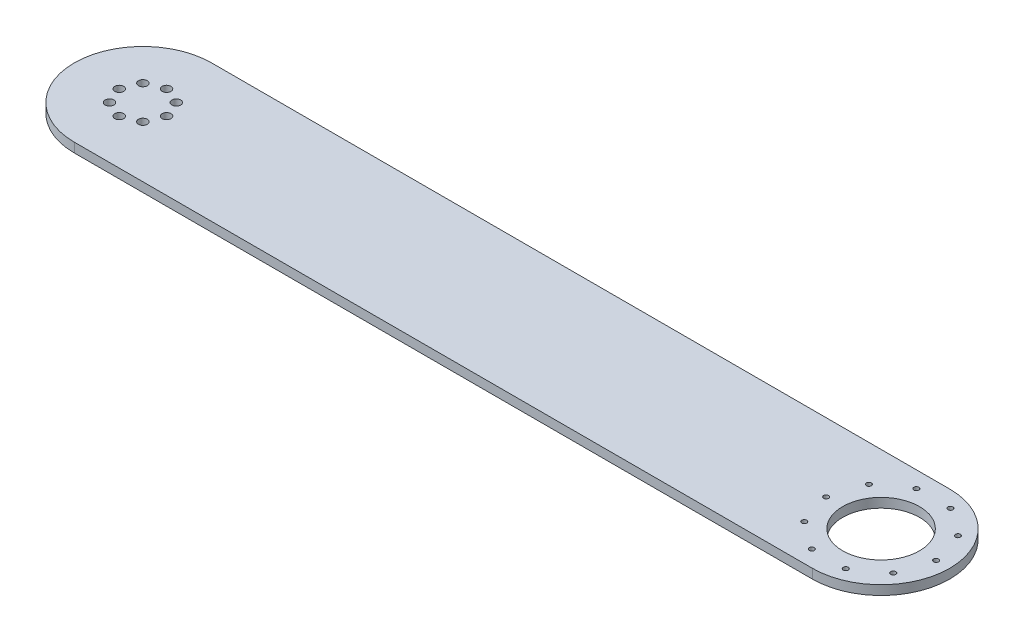
ISO-10303-21;
HEADER;
FILE_DESCRIPTION(('STEP AP214'),'2;1');
FILE_NAME('part.step','',(''),(''),'','','');
FILE_SCHEMA(('AUTOMOTIVE_DESIGN { 1 0 10303 214 1 1 1 1 }'));
ENDSEC;
DATA;
#1=APPLICATION_CONTEXT('core data for automotive mechanical design processes');
#2=APPLICATION_PROTOCOL_DEFINITION('international standard','automotive_design',2000,#1);
#3=PRODUCT_CONTEXT('',#1,'mechanical');
#4=PRODUCT('Part','Part','',(#3));
#5=PRODUCT_RELATED_PRODUCT_CATEGORY('part','',(#4));
#6=PRODUCT_DEFINITION_FORMATION('','',#4);
#7=PRODUCT_DEFINITION_CONTEXT('part definition',#1,'design');
#8=PRODUCT_DEFINITION('design','',#6,#7);
#9=PRODUCT_DEFINITION_SHAPE('','',#8);
#10=(LENGTH_UNIT() NAMED_UNIT(*) SI_UNIT(.MILLI.,.METRE.));
#11=(NAMED_UNIT(*) PLANE_ANGLE_UNIT() SI_UNIT($,.RADIAN.));
#12=(NAMED_UNIT(*) SI_UNIT($,.STERADIAN.) SOLID_ANGLE_UNIT());
#13=UNCERTAINTY_MEASURE_WITH_UNIT(LENGTH_MEASURE(1.E-05),#10,'distance_accuracy_value','');
#14=(GEOMETRIC_REPRESENTATION_CONTEXT(3) GLOBAL_UNCERTAINTY_ASSIGNED_CONTEXT((#13)) GLOBAL_UNIT_ASSIGNED_CONTEXT((#10,
#11,#12)) REPRESENTATION_CONTEXT('',''));
#15=CARTESIAN_POINT('',(0.,0.,0.));
#16=DIRECTION('',(0.,0.,1.));
#17=DIRECTION('',(1.,0.,0.));
#18=AXIS2_PLACEMENT_3D('',#15,#16,#17);
#19=CARTESIAN_POINT('',(0.,6.35,46.5));
#20=DIRECTION('',(0.,0.,-1.));
#21=DIRECTION('',(-1.,0.,0.));
#22=AXIS2_PLACEMENT_3D('',#19,#20,#21);
#23=PLANE('',#22);
#24=DIRECTION('',(1.,0.,0.));
#25=VECTOR('',#24,1.);
#26=CARTESIAN_POINT('',(0.,0.,46.5));
#27=LINE('',#26,#25);
#28=CARTESIAN_POINT('',(0.,0.,46.5));
#29=VERTEX_POINT('',#28);
#30=CARTESIAN_POINT('',(500.,0.,46.5));
#31=VERTEX_POINT('',#30);
#32=EDGE_CURVE('E159',#29,#31,#27,.T.);
#33=ORIENTED_EDGE('',*,*,#32,.T.);
#34=DIRECTION('',(0.,-1.,0.));
#35=VECTOR('',#34,1.);
#36=CARTESIAN_POINT('',(500.,6.35,46.5));
#37=LINE('',#36,#35);
#38=CARTESIAN_POINT('',(500.,6.35,46.5));
#39=VERTEX_POINT('',#38);
#40=EDGE_CURVE('E11',#39,#31,#37,.T.);
#41=ORIENTED_EDGE('',*,*,#40,.F.);
#42=DIRECTION('',(1.,0.,0.));
#43=VECTOR('',#42,1.);
#44=CARTESIAN_POINT('',(0.,6.35,46.5));
#45=LINE('',#44,#43);
#46=CARTESIAN_POINT('',(0.,6.35,46.5));
#47=VERTEX_POINT('',#46);
#48=EDGE_CURVE('E87',#47,#39,#45,.T.);
#49=ORIENTED_EDGE('',*,*,#48,.F.);
#50=DIRECTION('',(0.,-1.,0.));
#51=VECTOR('',#50,1.);
#52=CARTESIAN_POINT('',(0.,6.35,46.5));
#53=LINE('',#52,#51);
#54=EDGE_CURVE('E98',#47,#29,#53,.T.);
#55=ORIENTED_EDGE('',*,*,#54,.T.);
#56=EDGE_LOOP('',(#33,#41,#49,#55));
#57=FACE_BOUND('',#56,.T.);
#58=ADVANCED_FACE('F39',(#57),#23,.F.);
#59=CARTESIAN_POINT('',(500.,6.35,0.));
#60=DIRECTION('',(0.,-1.,0.));
#61=DIRECTION('',(0.,0.,-1.));
#62=AXIS2_PLACEMENT_3D('',#59,#60,#61);
#63=CYLINDRICAL_SURFACE('',#62,46.5);
#64=CARTESIAN_POINT('',(500.,0.,0.));
#65=DIRECTION('',(0.,1.,0.));
#66=DIRECTION('',(0.,0.,1.));
#67=AXIS2_PLACEMENT_3D('',#64,#65,#66);
#68=CIRCLE('',#67,46.5);
#69=CARTESIAN_POINT('',(500.,0.,-46.5));
#70=VERTEX_POINT('',#69);
#71=EDGE_CURVE('E92',#31,#70,#68,.T.);
#72=ORIENTED_EDGE('',*,*,#71,.T.);
#73=DIRECTION('',(0.,-1.,0.));
#74=VECTOR('',#73,1.);
#75=CARTESIAN_POINT('',(500.,6.35,-46.5));
#76=LINE('',#75,#74);
#77=CARTESIAN_POINT('',(500.,6.35,-46.5));
#78=VERTEX_POINT('',#77);
#79=EDGE_CURVE('E48',#78,#70,#76,.T.);
#80=ORIENTED_EDGE('',*,*,#79,.F.);
#81=CARTESIAN_POINT('',(500.,6.35,0.));
#82=DIRECTION('',(0.,1.,0.));
#83=DIRECTION('',(0.,0.,1.));
#84=AXIS2_PLACEMENT_3D('',#81,#82,#83);
#85=CIRCLE('',#84,46.5);
#86=EDGE_CURVE('E82',#39,#78,#85,.T.);
#87=ORIENTED_EDGE('',*,*,#86,.F.);
#88=ORIENTED_EDGE('',*,*,#40,.T.);
#89=EDGE_LOOP('',(#72,#80,#87,#88));
#90=FACE_BOUND('',#89,.T.);
#91=ADVANCED_FACE('F91',(#90),#63,.T.);
#92=CARTESIAN_POINT('',(0.,6.35,-46.5));
#93=DIRECTION('',(0.,0.,-1.));
#94=DIRECTION('',(-1.,0.,0.));
#95=AXIS2_PLACEMENT_3D('',#92,#93,#94);
#96=PLANE('',#95);
#97=DIRECTION('',(1.,0.,0.));
#98=VECTOR('',#97,1.);
#99=CARTESIAN_POINT('',(0.,0.,-46.5));
#100=LINE('',#99,#98);
#101=CARTESIAN_POINT('',(0.,0.,-46.5));
#102=VERTEX_POINT('',#101);
#103=EDGE_CURVE('E163',#102,#70,#100,.T.);
#104=ORIENTED_EDGE('',*,*,#103,.F.);
#105=DIRECTION('',(0.,-1.,0.));
#106=VECTOR('',#105,1.);
#107=CARTESIAN_POINT('',(0.,6.35,-46.5));
#108=LINE('',#107,#106);
#109=CARTESIAN_POINT('',(0.,6.35,-46.5));
#110=VERTEX_POINT('',#109);
#111=EDGE_CURVE('E72',#110,#102,#108,.T.);
#112=ORIENTED_EDGE('',*,*,#111,.F.);
#113=DIRECTION('',(1.,0.,0.));
#114=VECTOR('',#113,1.);
#115=CARTESIAN_POINT('',(0.,6.35,-46.5));
#116=LINE('',#115,#114);
#117=EDGE_CURVE('E85',#110,#78,#116,.T.);
#118=ORIENTED_EDGE('',*,*,#117,.T.);
#119=ORIENTED_EDGE('',*,*,#79,.T.);
#120=EDGE_LOOP('',(#104,#112,#118,#119));
#121=FACE_BOUND('',#120,.T.);
#122=ADVANCED_FACE('F96',(#121),#96,.T.);
#123=CARTESIAN_POINT('',(-16.,6.35,0.));
#124=DIRECTION('',(0.,-1.,0.));
#125=DIRECTION('',(0.,0.,-1.));
#126=AXIS2_PLACEMENT_3D('',#123,#124,#125);
#127=CYLINDRICAL_SURFACE('',#126,3.);
#128=CARTESIAN_POINT('',(-16.,6.35,0.));
#129=DIRECTION('',(0.,1.,0.));
#130=DIRECTION('',(0.,0.,1.));
#131=AXIS2_PLACEMENT_3D('',#128,#129,#130);
#132=CIRCLE('',#131,3.);
#133=CARTESIAN_POINT('',(-16.,6.35,3.));
#134=VERTEX_POINT('',#133);
#135=EDGE_CURVE('E374',#134,#134,#132,.T.);
#136=ORIENTED_EDGE('',*,*,#135,.T.);
#137=EDGE_LOOP('',(#136));
#138=FACE_BOUND('',#137,.T.);
#139=CARTESIAN_POINT('',(-16.,0.,0.));
#140=DIRECTION('',(0.,1.,0.));
#141=DIRECTION('',(0.,0.,1.));
#142=AXIS2_PLACEMENT_3D('',#139,#140,#141);
#143=CIRCLE('',#142,3.);
#144=CARTESIAN_POINT('',(-16.,0.,3.));
#145=VERTEX_POINT('',#144);
#146=EDGE_CURVE('E156',#145,#145,#143,.T.);
#147=ORIENTED_EDGE('',*,*,#146,.F.);
#148=EDGE_LOOP('',(#147));
#149=FACE_BOUND('',#148,.T.);
#150=ADVANCED_FACE('F191',(#138,#149),#127,.F.);
#151=CARTESIAN_POINT('',(-11.3137084989846,6.35,-11.3137084989849));
#152=DIRECTION('',(0.,-1.,0.));
#153=DIRECTION('',(0.,0.,-1.));
#154=AXIS2_PLACEMENT_3D('',#151,#152,#153);
#155=CYLINDRICAL_SURFACE('',#154,3.00000000000001);
#156=CARTESIAN_POINT('',(-11.3137084989846,6.35,-11.3137084989849));
#157=DIRECTION('',(0.,1.,0.));
#158=DIRECTION('',(0.,0.,1.));
#159=AXIS2_PLACEMENT_3D('',#156,#157,#158);
#160=CIRCLE('',#159,3.00000000000001);
#161=CARTESIAN_POINT('',(-11.3137084989846,6.35,-8.31370849898493));
#162=VERTEX_POINT('',#161);
#163=EDGE_CURVE('E371',#162,#162,#160,.T.);
#164=ORIENTED_EDGE('',*,*,#163,.T.);
#165=EDGE_LOOP('',(#164));
#166=FACE_BOUND('',#165,.T.);
#167=CARTESIAN_POINT('',(-11.3137084989846,0.,-11.3137084989849));
#168=DIRECTION('',(0.,1.,0.));
#169=DIRECTION('',(0.,0.,1.));
#170=AXIS2_PLACEMENT_3D('',#167,#168,#169);
#171=CIRCLE('',#170,3.00000000000001);
#172=CARTESIAN_POINT('',(-11.3137084989846,0.,-8.31370849898493));
#173=VERTEX_POINT('',#172);
#174=EDGE_CURVE('E153',#173,#173,#171,.T.);
#175=ORIENTED_EDGE('',*,*,#174,.F.);
#176=EDGE_LOOP('',(#175));
#177=FACE_BOUND('',#176,.T.);
#178=ADVANCED_FACE('F194',(#166,#177),#155,.F.);
#179=CARTESIAN_POINT('',(2.77555756156289E-13,6.35,-16.));
#180=DIRECTION('',(0.,-1.,0.));
#181=DIRECTION('',(0.,0.,-1.));
#182=AXIS2_PLACEMENT_3D('',#179,#180,#181);
#183=CYLINDRICAL_SURFACE('',#182,3.);
#184=CARTESIAN_POINT('',(2.77555756156289E-13,6.35,-16.));
#185=DIRECTION('',(0.,1.,0.));
#186=DIRECTION('',(0.,0.,1.));
#187=AXIS2_PLACEMENT_3D('',#184,#185,#186);
#188=CIRCLE('',#187,3.);
#189=CARTESIAN_POINT('',(2.77555756156289E-13,6.35,-13.));
#190=VERTEX_POINT('',#189);
#191=EDGE_CURVE('E368',#190,#190,#188,.T.);
#192=ORIENTED_EDGE('',*,*,#191,.T.);
#193=EDGE_LOOP('',(#192));
#194=FACE_BOUND('',#193,.T.);
#195=CARTESIAN_POINT('',(2.77555756156289E-13,0.,-16.));
#196=DIRECTION('',(0.,1.,0.));
#197=DIRECTION('',(0.,0.,1.));
#198=AXIS2_PLACEMENT_3D('',#195,#196,#197);
#199=CIRCLE('',#198,3.);
#200=CARTESIAN_POINT('',(2.77555756156289E-13,0.,-13.));
#201=VERTEX_POINT('',#200);
#202=EDGE_CURVE('E150',#201,#201,#199,.T.);
#203=ORIENTED_EDGE('',*,*,#202,.F.);
#204=EDGE_LOOP('',(#203));
#205=FACE_BOUND('',#204,.T.);
#206=ADVANCED_FACE('F198',(#194,#205),#183,.F.);
#207=CARTESIAN_POINT('',(11.3137084989848,6.35,-11.3137084989847));
#208=DIRECTION('',(0.,-1.,0.));
#209=DIRECTION('',(0.,0.,-1.));
#210=AXIS2_PLACEMENT_3D('',#207,#208,#209);
#211=CYLINDRICAL_SURFACE('',#210,3.);
#212=CARTESIAN_POINT('',(11.3137084989848,6.35,-11.3137084989847));
#213=DIRECTION('',(0.,1.,0.));
#214=DIRECTION('',(0.,0.,1.));
#215=AXIS2_PLACEMENT_3D('',#212,#213,#214);
#216=CIRCLE('',#215,3.);
#217=CARTESIAN_POINT('',(11.3137084989848,6.35,-8.3137084989847));
#218=VERTEX_POINT('',#217);
#219=EDGE_CURVE('E365',#218,#218,#216,.T.);
#220=ORIENTED_EDGE('',*,*,#219,.T.);
#221=EDGE_LOOP('',(#220));
#222=FACE_BOUND('',#221,.T.);
#223=CARTESIAN_POINT('',(11.3137084989848,0.,-11.3137084989847));
#224=DIRECTION('',(0.,1.,0.));
#225=DIRECTION('',(0.,0.,1.));
#226=AXIS2_PLACEMENT_3D('',#223,#224,#225);
#227=CIRCLE('',#226,3.);
#228=CARTESIAN_POINT('',(11.3137084989848,0.,-8.3137084989847));
#229=VERTEX_POINT('',#228);
#230=EDGE_CURVE('E147',#229,#229,#227,.T.);
#231=ORIENTED_EDGE('',*,*,#230,.F.);
#232=EDGE_LOOP('',(#231));
#233=FACE_BOUND('',#232,.T.);
#234=ADVANCED_FACE('F202',(#222,#233),#211,.F.);
#235=CARTESIAN_POINT('',(16.,6.35,1.13624387676481E-13));
#236=DIRECTION('',(0.,-1.,0.));
#237=DIRECTION('',(0.,0.,-1.));
#238=AXIS2_PLACEMENT_3D('',#235,#236,#237);
#239=CYLINDRICAL_SURFACE('',#238,3.00000000000005);
#240=CARTESIAN_POINT('',(16.,6.35,1.13624387676481E-13));
#241=DIRECTION('',(0.,1.,0.));
#242=DIRECTION('',(0.,0.,1.));
#243=AXIS2_PLACEMENT_3D('',#240,#241,#242);
#244=CIRCLE('',#243,3.00000000000005);
#245=CARTESIAN_POINT('',(16.,6.35,3.00000000000016));
#246=VERTEX_POINT('',#245);
#247=EDGE_CURVE('E362',#246,#246,#244,.T.);
#248=ORIENTED_EDGE('',*,*,#247,.T.);
#249=EDGE_LOOP('',(#248));
#250=FACE_BOUND('',#249,.T.);
#251=CARTESIAN_POINT('',(16.,0.,1.13624387676481E-13));
#252=DIRECTION('',(0.,1.,0.));
#253=DIRECTION('',(0.,0.,1.));
#254=AXIS2_PLACEMENT_3D('',#251,#252,#253);
#255=CIRCLE('',#254,3.00000000000005);
#256=CARTESIAN_POINT('',(16.,0.,3.00000000000016));
#257=VERTEX_POINT('',#256);
#258=EDGE_CURVE('E144',#257,#257,#255,.T.);
#259=ORIENTED_EDGE('',*,*,#258,.F.);
#260=EDGE_LOOP('',(#259));
#261=FACE_BOUND('',#260,.T.);
#262=ADVANCED_FACE('F206',(#250,#261),#239,.F.);
#263=CARTESIAN_POINT('',(11.3137084989847,6.35,11.3137084989849));
#264=DIRECTION('',(0.,-1.,0.));
#265=DIRECTION('',(0.,0.,-1.));
#266=AXIS2_PLACEMENT_3D('',#263,#264,#265);
#267=CYLINDRICAL_SURFACE('',#266,3.00000000000006);
#268=CARTESIAN_POINT('',(11.3137084989847,6.35,11.3137084989849));
#269=DIRECTION('',(0.,1.,0.));
#270=DIRECTION('',(0.,0.,1.));
#271=AXIS2_PLACEMENT_3D('',#268,#269,#270);
#272=CIRCLE('',#271,3.00000000000006);
#273=CARTESIAN_POINT('',(11.3137084989847,6.35,14.3137084989849));
#274=VERTEX_POINT('',#273);
#275=EDGE_CURVE('E359',#274,#274,#272,.T.);
#276=ORIENTED_EDGE('',*,*,#275,.T.);
#277=EDGE_LOOP('',(#276));
#278=FACE_BOUND('',#277,.T.);
#279=CARTESIAN_POINT('',(11.3137084989847,0.,11.3137084989849));
#280=DIRECTION('',(0.,1.,0.));
#281=DIRECTION('',(0.,0.,1.));
#282=AXIS2_PLACEMENT_3D('',#279,#280,#281);
#283=CIRCLE('',#282,3.00000000000006);
#284=CARTESIAN_POINT('',(11.3137084989847,0.,14.3137084989849));
#285=VERTEX_POINT('',#284);
#286=EDGE_CURVE('E141',#285,#285,#283,.T.);
#287=ORIENTED_EDGE('',*,*,#286,.F.);
#288=EDGE_LOOP('',(#287));
#289=FACE_BOUND('',#288,.T.);
#290=ADVANCED_FACE('F210',(#278,#289),#267,.F.);
#291=CARTESIAN_POINT('',(537.25,6.35,0.));
#292=DIRECTION('',(0.,-1.,0.));
#293=DIRECTION('',(0.,0.,-1.));
#294=AXIS2_PLACEMENT_3D('',#291,#292,#293);
#295=CYLINDRICAL_SURFACE('',#294,1.69999999999996);
#296=CARTESIAN_POINT('',(537.25,6.35,0.));
#297=DIRECTION('',(0.,1.,0.));
#298=DIRECTION('',(0.,0.,1.));
#299=AXIS2_PLACEMENT_3D('',#296,#297,#298);
#300=CIRCLE('',#299,1.69999999999996);
#301=CARTESIAN_POINT('',(537.25,6.35,1.69999999999996));
#302=VERTEX_POINT('',#301);
#303=EDGE_CURVE('E356',#302,#302,#300,.T.);
#304=ORIENTED_EDGE('',*,*,#303,.T.);
#305=EDGE_LOOP('',(#304));
#306=FACE_BOUND('',#305,.T.);
#307=CARTESIAN_POINT('',(537.25,0.,0.));
#308=DIRECTION('',(0.,1.,0.));
#309=DIRECTION('',(0.,0.,1.));
#310=AXIS2_PLACEMENT_3D('',#307,#308,#309);
#311=CIRCLE('',#310,1.69999999999996);
#312=CARTESIAN_POINT('',(537.25,0.,1.69999999999996));
#313=VERTEX_POINT('',#312);
#314=EDGE_CURVE('E138',#313,#313,#311,.T.);
#315=ORIENTED_EDGE('',*,*,#314,.F.);
#316=EDGE_LOOP('',(#315));
#317=FACE_BOUND('',#316,.T.);
#318=ADVANCED_FACE('F214',(#306,#317),#295,.F.);
#319=CARTESIAN_POINT('',(530.135883040467,6.35,21.8950006478946));
#320=DIRECTION('',(0.,-1.,0.));
#321=DIRECTION('',(0.,0.,-1.));
#322=AXIS2_PLACEMENT_3D('',#319,#320,#321);
#323=CYLINDRICAL_SURFACE('',#322,1.69999999999995);
#324=CARTESIAN_POINT('',(530.135883040467,6.35,21.8950006478946));
#325=DIRECTION('',(0.,1.,0.));
#326=DIRECTION('',(0.,0.,1.));
#327=AXIS2_PLACEMENT_3D('',#324,#325,#326);
#328=CIRCLE('',#327,1.69999999999995);
#329=CARTESIAN_POINT('',(530.135883040467,6.35,23.5950006478946));
#330=VERTEX_POINT('',#329);
#331=EDGE_CURVE('E353',#330,#330,#328,.T.);
#332=ORIENTED_EDGE('',*,*,#331,.T.);
#333=EDGE_LOOP('',(#332));
#334=FACE_BOUND('',#333,.T.);
#335=CARTESIAN_POINT('',(530.135883040467,0.,21.8950006478946));
#336=DIRECTION('',(0.,1.,0.));
#337=DIRECTION('',(0.,0.,1.));
#338=AXIS2_PLACEMENT_3D('',#335,#336,#337);
#339=CIRCLE('',#338,1.69999999999995);
#340=CARTESIAN_POINT('',(530.135883040467,0.,23.5950006478946));
#341=VERTEX_POINT('',#340);
#342=EDGE_CURVE('E135',#341,#341,#339,.T.);
#343=ORIENTED_EDGE('',*,*,#342,.F.);
#344=EDGE_LOOP('',(#343));
#345=FACE_BOUND('',#344,.T.);
#346=ADVANCED_FACE('F218',(#334,#345),#323,.F.);
#347=CARTESIAN_POINT('',(511.510883040467,6.35,35.4268552319945));
#348=DIRECTION('',(0.,-1.,0.));
#349=DIRECTION('',(0.,0.,-1.));
#350=AXIS2_PLACEMENT_3D('',#347,#348,#349);
#351=CYLINDRICAL_SURFACE('',#350,1.70000000000007);
#352=CARTESIAN_POINT('',(511.510883040467,6.35,35.4268552319945));
#353=DIRECTION('',(0.,1.,0.));
#354=DIRECTION('',(0.,0.,1.));
#355=AXIS2_PLACEMENT_3D('',#352,#353,#354);
#356=CIRCLE('',#355,1.70000000000007);
#357=CARTESIAN_POINT('',(511.510883040467,6.35,37.1268552319946));
#358=VERTEX_POINT('',#357);
#359=EDGE_CURVE('E350',#358,#358,#356,.T.);
#360=ORIENTED_EDGE('',*,*,#359,.T.);
#361=EDGE_LOOP('',(#360));
#362=FACE_BOUND('',#361,.T.);
#363=CARTESIAN_POINT('',(511.510883040467,0.,35.4268552319945));
#364=DIRECTION('',(0.,1.,0.));
#365=DIRECTION('',(0.,0.,1.));
#366=AXIS2_PLACEMENT_3D('',#363,#364,#365);
#367=CIRCLE('',#366,1.70000000000007);
#368=CARTESIAN_POINT('',(511.510883040467,0.,37.1268552319946));
#369=VERTEX_POINT('',#368);
#370=EDGE_CURVE('E132',#369,#369,#367,.T.);
#371=ORIENTED_EDGE('',*,*,#370,.F.);
#372=EDGE_LOOP('',(#371));
#373=FACE_BOUND('',#372,.T.);
#374=ADVANCED_FACE('F222',(#362,#373),#351,.F.);
#375=CARTESIAN_POINT('',(488.489116959533,6.35,35.4268552319945));
#376=DIRECTION('',(0.,-1.,0.));
#377=DIRECTION('',(0.,0.,-1.));
#378=AXIS2_PLACEMENT_3D('',#375,#376,#377);
#379=CYLINDRICAL_SURFACE('',#378,1.70000000000007);
#380=CARTESIAN_POINT('',(488.489116959533,6.35,35.4268552319945));
#381=DIRECTION('',(0.,1.,0.));
#382=DIRECTION('',(0.,0.,1.));
#383=AXIS2_PLACEMENT_3D('',#380,#381,#382);
#384=CIRCLE('',#383,1.70000000000007);
#385=CARTESIAN_POINT('',(488.489116959533,6.35,37.1268552319946));
#386=VERTEX_POINT('',#385);
#387=EDGE_CURVE('E347',#386,#386,#384,.T.);
#388=ORIENTED_EDGE('',*,*,#387,.T.);
#389=EDGE_LOOP('',(#388));
#390=FACE_BOUND('',#389,.T.);
#391=CARTESIAN_POINT('',(488.489116959533,0.,35.4268552319945));
#392=DIRECTION('',(0.,1.,0.));
#393=DIRECTION('',(0.,0.,1.));
#394=AXIS2_PLACEMENT_3D('',#391,#392,#393);
#395=CIRCLE('',#394,1.70000000000007);
#396=CARTESIAN_POINT('',(488.489116959533,0.,37.1268552319946));
#397=VERTEX_POINT('',#396);
#398=EDGE_CURVE('E129',#397,#397,#395,.T.);
#399=ORIENTED_EDGE('',*,*,#398,.F.);
#400=EDGE_LOOP('',(#399));
#401=FACE_BOUND('',#400,.T.);
#402=ADVANCED_FACE('F226',(#390,#401),#379,.F.);
#403=CARTESIAN_POINT('',(469.864116959533,6.35,21.8950006478946));
#404=DIRECTION('',(0.,-1.,0.));
#405=DIRECTION('',(0.,0.,-1.));
#406=AXIS2_PLACEMENT_3D('',#403,#404,#405);
#407=CYLINDRICAL_SURFACE('',#406,1.70000000000007);
#408=CARTESIAN_POINT('',(469.864116959533,6.35,21.8950006478946));
#409=DIRECTION('',(0.,1.,0.));
#410=DIRECTION('',(0.,0.,1.));
#411=AXIS2_PLACEMENT_3D('',#408,#409,#410);
#412=CIRCLE('',#411,1.70000000000007);
#413=CARTESIAN_POINT('',(469.864116959533,6.35,23.5950006478947));
#414=VERTEX_POINT('',#413);
#415=EDGE_CURVE('E344',#414,#414,#412,.T.);
#416=ORIENTED_EDGE('',*,*,#415,.T.);
#417=EDGE_LOOP('',(#416));
#418=FACE_BOUND('',#417,.T.);
#419=CARTESIAN_POINT('',(469.864116959533,0.,21.8950006478946));
#420=DIRECTION('',(0.,1.,0.));
#421=DIRECTION('',(0.,0.,1.));
#422=AXIS2_PLACEMENT_3D('',#419,#420,#421);
#423=CIRCLE('',#422,1.70000000000007);
#424=CARTESIAN_POINT('',(469.864116959533,0.,23.5950006478947));
#425=VERTEX_POINT('',#424);
#426=EDGE_CURVE('E126',#425,#425,#423,.T.);
#427=ORIENTED_EDGE('',*,*,#426,.F.);
#428=EDGE_LOOP('',(#427));
#429=FACE_BOUND('',#428,.T.);
#430=ADVANCED_FACE('F230',(#418,#429),#407,.F.);
#431=CARTESIAN_POINT('',(462.75,6.35,0.));
#432=DIRECTION('',(0.,-1.,0.));
#433=DIRECTION('',(0.,0.,-1.));
#434=AXIS2_PLACEMENT_3D('',#431,#432,#433);
#435=CYLINDRICAL_SURFACE('',#434,1.69999999999996);
#436=CARTESIAN_POINT('',(462.75,6.35,0.));
#437=DIRECTION('',(0.,1.,0.));
#438=DIRECTION('',(0.,0.,1.));
#439=AXIS2_PLACEMENT_3D('',#436,#437,#438);
#440=CIRCLE('',#439,1.69999999999996);
#441=CARTESIAN_POINT('',(462.75,6.35,1.69999999999996));
#442=VERTEX_POINT('',#441);
#443=EDGE_CURVE('E341',#442,#442,#440,.T.);
#444=ORIENTED_EDGE('',*,*,#443,.T.);
#445=EDGE_LOOP('',(#444));
#446=FACE_BOUND('',#445,.T.);
#447=CARTESIAN_POINT('',(462.75,0.,0.));
#448=DIRECTION('',(0.,1.,0.));
#449=DIRECTION('',(0.,0.,1.));
#450=AXIS2_PLACEMENT_3D('',#447,#448,#449);
#451=CIRCLE('',#450,1.69999999999996);
#452=CARTESIAN_POINT('',(462.75,0.,1.69999999999996));
#453=VERTEX_POINT('',#452);
#454=EDGE_CURVE('E123',#453,#453,#451,.T.);
#455=ORIENTED_EDGE('',*,*,#454,.F.);
#456=EDGE_LOOP('',(#455));
#457=FACE_BOUND('',#456,.T.);
#458=ADVANCED_FACE('F234',(#446,#457),#435,.F.);
#459=CARTESIAN_POINT('',(469.864116959533,6.35,-21.8950006478946));
#460=DIRECTION('',(0.,-1.,0.));
#461=DIRECTION('',(0.,0.,-1.));
#462=AXIS2_PLACEMENT_3D('',#459,#460,#461);
#463=CYLINDRICAL_SURFACE('',#462,1.69999999999996);
#464=CARTESIAN_POINT('',(469.864116959533,6.35,-21.8950006478946));
#465=DIRECTION('',(0.,1.,0.));
#466=DIRECTION('',(0.,0.,1.));
#467=AXIS2_PLACEMENT_3D('',#464,#465,#466);
#468=CIRCLE('',#467,1.69999999999996);
#469=CARTESIAN_POINT('',(469.864116959533,6.35,-20.1950006478947));
#470=VERTEX_POINT('',#469);
#471=EDGE_CURVE('E338',#470,#470,#468,.T.);
#472=ORIENTED_EDGE('',*,*,#471,.T.);
#473=EDGE_LOOP('',(#472));
#474=FACE_BOUND('',#473,.T.);
#475=CARTESIAN_POINT('',(469.864116959533,0.,-21.8950006478946));
#476=DIRECTION('',(0.,1.,0.));
#477=DIRECTION('',(0.,0.,1.));
#478=AXIS2_PLACEMENT_3D('',#475,#476,#477);
#479=CIRCLE('',#478,1.69999999999996);
#480=CARTESIAN_POINT('',(469.864116959533,0.,-20.1950006478947));
#481=VERTEX_POINT('',#480);
#482=EDGE_CURVE('E120',#481,#481,#479,.T.);
#483=ORIENTED_EDGE('',*,*,#482,.F.);
#484=EDGE_LOOP('',(#483));
#485=FACE_BOUND('',#484,.T.);
#486=ADVANCED_FACE('F238',(#474,#485),#463,.F.);
#487=CARTESIAN_POINT('',(488.489116959533,6.35,-35.4268552319945));
#488=DIRECTION('',(0.,-1.,0.));
#489=DIRECTION('',(0.,0.,-1.));
#490=AXIS2_PLACEMENT_3D('',#487,#488,#489);
#491=CYLINDRICAL_SURFACE('',#490,1.70000000000007);
#492=CARTESIAN_POINT('',(488.489116959533,6.35,-35.4268552319945));
#493=DIRECTION('',(0.,1.,0.));
#494=DIRECTION('',(0.,0.,1.));
#495=AXIS2_PLACEMENT_3D('',#492,#493,#494);
#496=CIRCLE('',#495,1.70000000000007);
#497=CARTESIAN_POINT('',(488.489116959533,6.35,-33.7268552319944));
#498=VERTEX_POINT('',#497);
#499=EDGE_CURVE('E335',#498,#498,#496,.T.);
#500=ORIENTED_EDGE('',*,*,#499,.T.);
#501=EDGE_LOOP('',(#500));
#502=FACE_BOUND('',#501,.T.);
#503=CARTESIAN_POINT('',(488.489116959533,0.,-35.4268552319945));
#504=DIRECTION('',(0.,1.,0.));
#505=DIRECTION('',(0.,0.,1.));
#506=AXIS2_PLACEMENT_3D('',#503,#504,#505);
#507=CIRCLE('',#506,1.70000000000007);
#508=CARTESIAN_POINT('',(488.489116959533,0.,-33.7268552319944));
#509=VERTEX_POINT('',#508);
#510=EDGE_CURVE('E117',#509,#509,#507,.T.);
#511=ORIENTED_EDGE('',*,*,#510,.F.);
#512=EDGE_LOOP('',(#511));
#513=FACE_BOUND('',#512,.T.);
#514=ADVANCED_FACE('F242',(#502,#513),#491,.F.);
#515=CARTESIAN_POINT('',(511.510883040467,6.35,-35.4268552319945));
#516=DIRECTION('',(0.,-1.,0.));
#517=DIRECTION('',(0.,0.,-1.));
#518=AXIS2_PLACEMENT_3D('',#515,#516,#517);
#519=CYLINDRICAL_SURFACE('',#518,1.70000000000018);
#520=CARTESIAN_POINT('',(511.510883040467,6.35,-35.4268552319945));
#521=DIRECTION('',(0.,1.,0.));
#522=DIRECTION('',(0.,0.,1.));
#523=AXIS2_PLACEMENT_3D('',#520,#521,#522);
#524=CIRCLE('',#523,1.70000000000018);
#525=CARTESIAN_POINT('',(511.510883040467,6.35,-33.7268552319943));
#526=VERTEX_POINT('',#525);
#527=EDGE_CURVE('E332',#526,#526,#524,.T.);
#528=ORIENTED_EDGE('',*,*,#527,.T.);
#529=EDGE_LOOP('',(#528));
#530=FACE_BOUND('',#529,.T.);
#531=CARTESIAN_POINT('',(511.510883040467,0.,-35.4268552319945));
#532=DIRECTION('',(0.,1.,0.));
#533=DIRECTION('',(0.,0.,1.));
#534=AXIS2_PLACEMENT_3D('',#531,#532,#533);
#535=CIRCLE('',#534,1.70000000000018);
#536=CARTESIAN_POINT('',(511.510883040467,0.,-33.7268552319943));
#537=VERTEX_POINT('',#536);
#538=EDGE_CURVE('E114',#537,#537,#535,.T.);
#539=ORIENTED_EDGE('',*,*,#538,.F.);
#540=EDGE_LOOP('',(#539));
#541=FACE_BOUND('',#540,.T.);
#542=ADVANCED_FACE('F246',(#530,#541),#519,.F.);
#543=CARTESIAN_POINT('',(530.135883040467,6.35,-21.8950006478946));
#544=DIRECTION('',(0.,-1.,0.));
#545=DIRECTION('',(0.,0.,-1.));
#546=AXIS2_PLACEMENT_3D('',#543,#544,#545);
#547=CYLINDRICAL_SURFACE('',#546,1.70000000000007);
#548=CARTESIAN_POINT('',(530.135883040467,6.35,-21.8950006478946));
#549=DIRECTION('',(0.,1.,0.));
#550=DIRECTION('',(0.,0.,1.));
#551=AXIS2_PLACEMENT_3D('',#548,#549,#550);
#552=CIRCLE('',#551,1.70000000000007);
#553=CARTESIAN_POINT('',(530.135883040467,6.35,-20.1950006478946));
#554=VERTEX_POINT('',#553);
#555=EDGE_CURVE('E325',#554,#554,#552,.T.);
#556=ORIENTED_EDGE('',*,*,#555,.T.);
#557=EDGE_LOOP('',(#556));
#558=FACE_BOUND('',#557,.T.);
#559=CARTESIAN_POINT('',(530.135883040467,0.,-21.8950006478946));
#560=DIRECTION('',(0.,1.,0.));
#561=DIRECTION('',(0.,0.,1.));
#562=AXIS2_PLACEMENT_3D('',#559,#560,#561);
#563=CIRCLE('',#562,1.70000000000007);
#564=CARTESIAN_POINT('',(530.135883040467,0.,-20.1950006478946));
#565=VERTEX_POINT('',#564);
#566=EDGE_CURVE('E111',#565,#565,#563,.T.);
#567=ORIENTED_EDGE('',*,*,#566,.F.);
#568=EDGE_LOOP('',(#567));
#569=FACE_BOUND('',#568,.T.);
#570=ADVANCED_FACE('F250',(#558,#569),#547,.F.);
#571=CARTESIAN_POINT('',(500.,6.35,0.));
#572=DIRECTION('',(0.,-1.,0.));
#573=DIRECTION('',(0.,0.,-1.));
#574=AXIS2_PLACEMENT_3D('',#571,#572,#573);
#575=CYLINDRICAL_SURFACE('',#574,26.0000000000001);
#576=CARTESIAN_POINT('',(500.,6.35,0.));
#577=DIRECTION('',(0.,1.,0.));
#578=DIRECTION('',(0.,0.,1.));
#579=AXIS2_PLACEMENT_3D('',#576,#577,#578);
#580=CIRCLE('',#579,26.0000000000001);
#581=CARTESIAN_POINT('',(500.,6.35,26.0000000000001));
#582=VERTEX_POINT('',#581);
#583=EDGE_CURVE('E322',#582,#582,#580,.T.);
#584=ORIENTED_EDGE('',*,*,#583,.T.);
#585=EDGE_LOOP('',(#584));
#586=FACE_BOUND('',#585,.T.);
#587=CARTESIAN_POINT('',(500.,0.,0.));
#588=DIRECTION('',(0.,1.,0.));
#589=DIRECTION('',(0.,0.,1.));
#590=AXIS2_PLACEMENT_3D('',#587,#588,#589);
#591=CIRCLE('',#590,26.0000000000001);
#592=CARTESIAN_POINT('',(500.,0.,26.0000000000001));
#593=VERTEX_POINT('',#592);
#594=EDGE_CURVE('E108',#593,#593,#591,.T.);
#595=ORIENTED_EDGE('',*,*,#594,.F.);
#596=EDGE_LOOP('',(#595));
#597=FACE_BOUND('',#596,.T.);
#598=ADVANCED_FACE('F254',(#586,#597),#575,.F.);
#599=CARTESIAN_POINT('',(-1.65201186064223E-13,6.35,16.));
#600=DIRECTION('',(0.,-1.,0.));
#601=DIRECTION('',(0.,0.,-1.));
#602=AXIS2_PLACEMENT_3D('',#599,#600,#601);
#603=CYLINDRICAL_SURFACE('',#602,3.);
#604=CARTESIAN_POINT('',(-1.65201186064223E-13,6.35,16.));
#605=DIRECTION('',(0.,1.,0.));
#606=DIRECTION('',(0.,0.,1.));
#607=AXIS2_PLACEMENT_3D('',#604,#605,#606);
#608=CIRCLE('',#607,3.);
#609=CARTESIAN_POINT('',(-1.65201186064223E-13,6.35,19.));
#610=VERTEX_POINT('',#609);
#611=EDGE_CURVE('E268',#610,#610,#608,.T.);
#612=ORIENTED_EDGE('',*,*,#611,.T.);
#613=EDGE_LOOP('',(#612));
#614=FACE_BOUND('',#613,.T.);
#615=CARTESIAN_POINT('',(-1.65201186064223E-13,0.,16.));
#616=DIRECTION('',(0.,1.,0.));
#617=DIRECTION('',(0.,0.,1.));
#618=AXIS2_PLACEMENT_3D('',#615,#616,#617);
#619=CIRCLE('',#618,3.);
#620=CARTESIAN_POINT('',(-1.65201186064223E-13,0.,19.));
#621=VERTEX_POINT('',#620);
#622=EDGE_CURVE('E105',#621,#621,#619,.T.);
#623=ORIENTED_EDGE('',*,*,#622,.F.);
#624=EDGE_LOOP('',(#623));
#625=FACE_BOUND('',#624,.T.);
#626=ADVANCED_FACE('F257',(#614,#625),#603,.F.);
#627=CARTESIAN_POINT('',(-11.3137084989848,6.35,11.3137084989848));
#628=DIRECTION('',(0.,-1.,0.));
#629=DIRECTION('',(0.,0.,-1.));
#630=AXIS2_PLACEMENT_3D('',#627,#628,#629);
#631=CYLINDRICAL_SURFACE('',#630,3.00000000000005);
#632=CARTESIAN_POINT('',(-11.3137084989848,6.35,11.3137084989848));
#633=DIRECTION('',(0.,1.,0.));
#634=DIRECTION('',(0.,0.,1.));
#635=AXIS2_PLACEMENT_3D('',#632,#633,#634);
#636=CIRCLE('',#635,3.00000000000005);
#637=CARTESIAN_POINT('',(-11.3137084989848,6.35,14.3137084989848));
#638=VERTEX_POINT('',#637);
#639=EDGE_CURVE('E166',#638,#638,#636,.T.);
#640=ORIENTED_EDGE('',*,*,#639,.T.);
#641=EDGE_LOOP('',(#640));
#642=FACE_BOUND('',#641,.T.);
#643=CARTESIAN_POINT('',(-11.3137084989848,0.,11.3137084989848));
#644=DIRECTION('',(0.,1.,0.));
#645=DIRECTION('',(0.,0.,1.));
#646=AXIS2_PLACEMENT_3D('',#643,#644,#645);
#647=CIRCLE('',#646,3.00000000000005);
#648=CARTESIAN_POINT('',(-11.3137084989848,0.,14.3137084989848));
#649=VERTEX_POINT('',#648);
#650=EDGE_CURVE('E102',#649,#649,#647,.T.);
#651=ORIENTED_EDGE('',*,*,#650,.F.);
#652=EDGE_LOOP('',(#651));
#653=FACE_BOUND('',#652,.T.);
#654=ADVANCED_FACE('F41',(#642,#653),#631,.F.);
#655=CARTESIAN_POINT('',(0.,6.35,0.));
#656=DIRECTION('',(0.,-1.,0.));
#657=DIRECTION('',(0.,0.,-1.));
#658=AXIS2_PLACEMENT_3D('',#655,#656,#657);
#659=CYLINDRICAL_SURFACE('',#658,46.5);
#660=CARTESIAN_POINT('',(0.,0.,0.));
#661=DIRECTION('',(0.,1.,0.));
#662=DIRECTION('',(0.,0.,1.));
#663=AXIS2_PLACEMENT_3D('',#660,#661,#662);
#664=CIRCLE('',#663,46.5);
#665=EDGE_CURVE('E75',#102,#29,#664,.T.);
#666=ORIENTED_EDGE('',*,*,#665,.T.);
#667=ORIENTED_EDGE('',*,*,#54,.F.);
#668=CARTESIAN_POINT('',(0.,6.35,0.));
#669=DIRECTION('',(0.,1.,0.));
#670=DIRECTION('',(0.,0.,1.));
#671=AXIS2_PLACEMENT_3D('',#668,#669,#670);
#672=CIRCLE('',#671,46.5);
#673=EDGE_CURVE('E56',#110,#47,#672,.T.);
#674=ORIENTED_EDGE('',*,*,#673,.F.);
#675=ORIENTED_EDGE('',*,*,#111,.T.);
#676=EDGE_LOOP('',(#666,#667,#674,#675));
#677=FACE_BOUND('',#676,.T.);
#678=ADVANCED_FACE('F178',(#677),#659,.T.);
#679=CARTESIAN_POINT('',(0.,6.35,0.));
#680=DIRECTION('',(0.,1.,0.));
#681=DIRECTION('',(0.,0.,1.));
#682=AXIS2_PLACEMENT_3D('',#679,#680,#681);
#683=PLANE('',#682);
#684=ORIENTED_EDGE('',*,*,#639,.F.);
#685=EDGE_LOOP('',(#684));
#686=FACE_BOUND('',#685,.T.);
#687=ORIENTED_EDGE('',*,*,#611,.F.);
#688=EDGE_LOOP('',(#687));
#689=FACE_BOUND('',#688,.T.);
#690=ORIENTED_EDGE('',*,*,#583,.F.);
#691=EDGE_LOOP('',(#690));
#692=FACE_BOUND('',#691,.T.);
#693=ORIENTED_EDGE('',*,*,#555,.F.);
#694=EDGE_LOOP('',(#693));
#695=FACE_BOUND('',#694,.T.);
#696=ORIENTED_EDGE('',*,*,#527,.F.);
#697=EDGE_LOOP('',(#696));
#698=FACE_BOUND('',#697,.T.);
#699=ORIENTED_EDGE('',*,*,#499,.F.);
#700=EDGE_LOOP('',(#699));
#701=FACE_BOUND('',#700,.T.);
#702=ORIENTED_EDGE('',*,*,#471,.F.);
#703=EDGE_LOOP('',(#702));
#704=FACE_BOUND('',#703,.T.);
#705=ORIENTED_EDGE('',*,*,#443,.F.);
#706=EDGE_LOOP('',(#705));
#707=FACE_BOUND('',#706,.T.);
#708=ORIENTED_EDGE('',*,*,#415,.F.);
#709=EDGE_LOOP('',(#708));
#710=FACE_BOUND('',#709,.T.);
#711=ORIENTED_EDGE('',*,*,#387,.F.);
#712=EDGE_LOOP('',(#711));
#713=FACE_BOUND('',#712,.T.);
#714=ORIENTED_EDGE('',*,*,#359,.F.);
#715=EDGE_LOOP('',(#714));
#716=FACE_BOUND('',#715,.T.);
#717=ORIENTED_EDGE('',*,*,#331,.F.);
#718=EDGE_LOOP('',(#717));
#719=FACE_BOUND('',#718,.T.);
#720=ORIENTED_EDGE('',*,*,#303,.F.);
#721=EDGE_LOOP('',(#720));
#722=FACE_BOUND('',#721,.T.);
#723=ORIENTED_EDGE('',*,*,#275,.F.);
#724=EDGE_LOOP('',(#723));
#725=FACE_BOUND('',#724,.T.);
#726=ORIENTED_EDGE('',*,*,#247,.F.);
#727=EDGE_LOOP('',(#726));
#728=FACE_BOUND('',#727,.T.);
#729=ORIENTED_EDGE('',*,*,#219,.F.);
#730=EDGE_LOOP('',(#729));
#731=FACE_BOUND('',#730,.T.);
#732=ORIENTED_EDGE('',*,*,#191,.F.);
#733=EDGE_LOOP('',(#732));
#734=FACE_BOUND('',#733,.T.);
#735=ORIENTED_EDGE('',*,*,#163,.F.);
#736=EDGE_LOOP('',(#735));
#737=FACE_BOUND('',#736,.T.);
#738=ORIENTED_EDGE('',*,*,#135,.F.);
#739=EDGE_LOOP('',(#738));
#740=FACE_BOUND('',#739,.T.);
#741=ORIENTED_EDGE('',*,*,#48,.T.);
#742=ORIENTED_EDGE('',*,*,#86,.T.);
#743=ORIENTED_EDGE('',*,*,#117,.F.);
#744=ORIENTED_EDGE('',*,*,#673,.T.);
#745=EDGE_LOOP('',(#741,#742,#743,#744));
#746=FACE_BOUND('',#745,.T.);
#747=ADVANCED_FACE('F83',(#686,#689,#692,#695,#698,#701,#704,#707,#710,#713,#716,#719,#722,#725,
#728,#731,#734,#737,#740,#746),#683,.T.);
#748=CARTESIAN_POINT('',(0.,0.,0.));
#749=DIRECTION('',(0.,1.,0.));
#750=DIRECTION('',(0.,0.,1.));
#751=AXIS2_PLACEMENT_3D('',#748,#749,#750);
#752=PLANE('',#751);
#753=ORIENTED_EDGE('',*,*,#650,.T.);
#754=EDGE_LOOP('',(#753));
#755=FACE_BOUND('',#754,.T.);
#756=ORIENTED_EDGE('',*,*,#622,.T.);
#757=EDGE_LOOP('',(#756));
#758=FACE_BOUND('',#757,.T.);
#759=ORIENTED_EDGE('',*,*,#594,.T.);
#760=EDGE_LOOP('',(#759));
#761=FACE_BOUND('',#760,.T.);
#762=ORIENTED_EDGE('',*,*,#566,.T.);
#763=EDGE_LOOP('',(#762));
#764=FACE_BOUND('',#763,.T.);
#765=ORIENTED_EDGE('',*,*,#538,.T.);
#766=EDGE_LOOP('',(#765));
#767=FACE_BOUND('',#766,.T.);
#768=ORIENTED_EDGE('',*,*,#510,.T.);
#769=EDGE_LOOP('',(#768));
#770=FACE_BOUND('',#769,.T.);
#771=ORIENTED_EDGE('',*,*,#482,.T.);
#772=EDGE_LOOP('',(#771));
#773=FACE_BOUND('',#772,.T.);
#774=ORIENTED_EDGE('',*,*,#454,.T.);
#775=EDGE_LOOP('',(#774));
#776=FACE_BOUND('',#775,.T.);
#777=ORIENTED_EDGE('',*,*,#426,.T.);
#778=EDGE_LOOP('',(#777));
#779=FACE_BOUND('',#778,.T.);
#780=ORIENTED_EDGE('',*,*,#398,.T.);
#781=EDGE_LOOP('',(#780));
#782=FACE_BOUND('',#781,.T.);
#783=ORIENTED_EDGE('',*,*,#370,.T.);
#784=EDGE_LOOP('',(#783));
#785=FACE_BOUND('',#784,.T.);
#786=ORIENTED_EDGE('',*,*,#342,.T.);
#787=EDGE_LOOP('',(#786));
#788=FACE_BOUND('',#787,.T.);
#789=ORIENTED_EDGE('',*,*,#314,.T.);
#790=EDGE_LOOP('',(#789));
#791=FACE_BOUND('',#790,.T.);
#792=ORIENTED_EDGE('',*,*,#286,.T.);
#793=EDGE_LOOP('',(#792));
#794=FACE_BOUND('',#793,.T.);
#795=ORIENTED_EDGE('',*,*,#258,.T.);
#796=EDGE_LOOP('',(#795));
#797=FACE_BOUND('',#796,.T.);
#798=ORIENTED_EDGE('',*,*,#230,.T.);
#799=EDGE_LOOP('',(#798));
#800=FACE_BOUND('',#799,.T.);
#801=ORIENTED_EDGE('',*,*,#202,.T.);
#802=EDGE_LOOP('',(#801));
#803=FACE_BOUND('',#802,.T.);
#804=ORIENTED_EDGE('',*,*,#174,.T.);
#805=EDGE_LOOP('',(#804));
#806=FACE_BOUND('',#805,.T.);
#807=ORIENTED_EDGE('',*,*,#146,.T.);
#808=EDGE_LOOP('',(#807));
#809=FACE_BOUND('',#808,.T.);
#810=ORIENTED_EDGE('',*,*,#32,.F.);
#811=ORIENTED_EDGE('',*,*,#665,.F.);
#812=ORIENTED_EDGE('',*,*,#103,.T.);
#813=ORIENTED_EDGE('',*,*,#71,.F.);
#814=EDGE_LOOP('',(#810,#811,#812,#813));
#815=FACE_BOUND('',#814,.T.);
#816=ADVANCED_FACE('F171',(#755,#758,#761,#764,#767,#770,#773,#776,#779,#782,#785,#788,#791,
#794,#797,#800,#803,#806,#809,#815),#752,.F.);
#817=CLOSED_SHELL('',(#58,#91,#122,#150,#178,#206,#234,#262,#290,#318,#346,#374,#402,#430,#458,
#486,#514,#542,#570,#598,#626,#654,#678,#747,#816));
#818=MANIFOLD_SOLID_BREP('B2',#817);
#819=ADVANCED_BREP_SHAPE_REPRESENTATION('',(#18,#818),#14);
#820=SHAPE_DEFINITION_REPRESENTATION(#9,#819);
ENDSEC;
END-ISO-10303-21;
